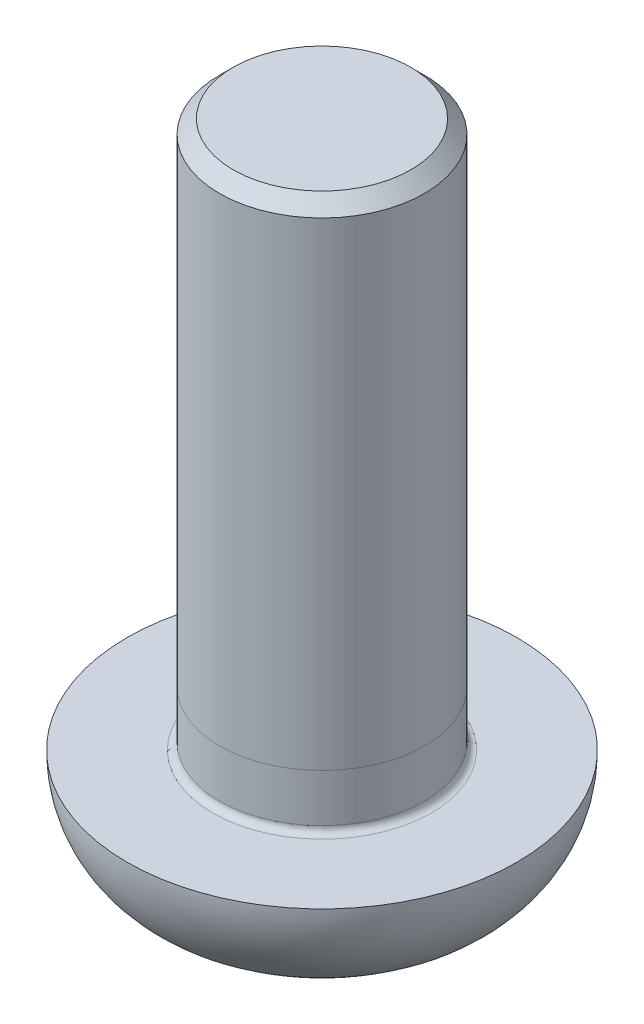
ISO-10303-21;
HEADER;
FILE_DESCRIPTION(('STEP AP214'),'2;1');
FILE_NAME('part.step','',(''),(''),'','','');
FILE_SCHEMA(('AUTOMOTIVE_DESIGN { 1 0 10303 214 1 1 1 1 }'));
ENDSEC;
DATA;
#1=APPLICATION_CONTEXT('core data for automotive mechanical design processes');
#2=APPLICATION_PROTOCOL_DEFINITION('international standard','automotive_design',2000,#1);
#3=PRODUCT_CONTEXT('',#1,'mechanical');
#4=PRODUCT('Part','Part','',(#3));
#5=PRODUCT_RELATED_PRODUCT_CATEGORY('part','',(#4));
#6=PRODUCT_DEFINITION_FORMATION('','',#4);
#7=PRODUCT_DEFINITION_CONTEXT('part definition',#1,'design');
#8=PRODUCT_DEFINITION('design','',#6,#7);
#9=PRODUCT_DEFINITION_SHAPE('','',#8);
#10=(LENGTH_UNIT() NAMED_UNIT(*) SI_UNIT(.MILLI.,.METRE.));
#11=(NAMED_UNIT(*) PLANE_ANGLE_UNIT() SI_UNIT($,.RADIAN.));
#12=(NAMED_UNIT(*) SI_UNIT($,.STERADIAN.) SOLID_ANGLE_UNIT());
#13=UNCERTAINTY_MEASURE_WITH_UNIT(LENGTH_MEASURE(1.E-05),#10,'distance_accuracy_value','');
#14=(GEOMETRIC_REPRESENTATION_CONTEXT(3) GLOBAL_UNCERTAINTY_ASSIGNED_CONTEXT((#13)) GLOBAL_UNIT_ASSIGNED_CONTEXT((#10,
#11,#12)) REPRESENTATION_CONTEXT('',''));
#15=CARTESIAN_POINT('',(0.,0.,0.));
#16=DIRECTION('',(0.,0.,1.));
#17=DIRECTION('',(1.,0.,0.));
#18=AXIS2_PLACEMENT_3D('',#15,#16,#17);
#19=CARTESIAN_POINT('',(0.,0.,0.));
#20=DIRECTION('',(0.,1.,0.));
#21=DIRECTION('',(0.,0.,1.));
#22=AXIS2_PLACEMENT_3D('',#19,#20,#21);
#23=CYLINDRICAL_SURFACE('',#22,1.5);
#24=CARTESIAN_POINT('',(0.,7.8,0.));
#25=DIRECTION('',(0.,1.,0.));
#26=DIRECTION('',(0.,0.,1.));
#27=AXIS2_PLACEMENT_3D('',#24,#25,#26);
#28=CIRCLE('',#27,1.5);
#29=CARTESIAN_POINT('',(0.,7.8,1.5));
#30=VERTEX_POINT('',#29);
#31=EDGE_CURVE('E28',#30,#30,#28,.F.);
#32=ORIENTED_EDGE('',*,*,#31,.T.);
#33=EDGE_LOOP('',(#32));
#34=FACE_BOUND('',#33,.T.);
#35=CARTESIAN_POINT('',(0.,0.8,0.));
#36=DIRECTION('',(0.,1.,0.));
#37=DIRECTION('',(0.,0.,1.));
#38=AXIS2_PLACEMENT_3D('',#35,#36,#37);
#39=CIRCLE('',#38,1.5);
#40=CARTESIAN_POINT('',(0.,0.8,1.5));
#41=VERTEX_POINT('',#40);
#42=EDGE_CURVE('E11',#41,#41,#39,.T.);
#43=ORIENTED_EDGE('',*,*,#42,.T.);
#44=EDGE_LOOP('',(#43));
#45=FACE_BOUND('',#44,.T.);
#46=ADVANCED_FACE('F18',(#34,#45),#23,.T.);
#47=ORIENTED_EDGE('',*,*,#42,.F.);
#48=EDGE_LOOP('',(#47));
#49=FACE_BOUND('',#48,.T.);
#50=CARTESIAN_POINT('',(0.,0.1,0.));
#51=DIRECTION('',(0.,1.,0.));
#52=DIRECTION('',(0.,0.,1.));
#53=AXIS2_PLACEMENT_3D('',#50,#51,#52);
#54=CIRCLE('',#53,1.5);
#55=CARTESIAN_POINT('',(0.,0.1,1.5));
#56=VERTEX_POINT('',#55);
#57=EDGE_CURVE('E280',#56,#56,#54,.T.);
#58=ORIENTED_EDGE('',*,*,#57,.T.);
#59=EDGE_LOOP('',(#58));
#60=FACE_BOUND('',#59,.T.);
#61=ADVANCED_FACE('F192',(#49,#60),#23,.T.);
#62=CARTESIAN_POINT('',(2.85,0.,0.));
#63=DIRECTION('',(0.,1.,0.));
#64=DIRECTION('',(0.,0.,1.));
#65=AXIS2_PLACEMENT_3D('',#62,#63,#64);
#66=PLANE('',#65);
#67=CARTESIAN_POINT('',(0.,0.,0.));
#68=DIRECTION('',(0.,1.,0.));
#69=DIRECTION('',(0.,0.,1.));
#70=AXIS2_PLACEMENT_3D('',#67,#68,#69);
#71=CIRCLE('',#70,1.6);
#72=CARTESIAN_POINT('',(0.,0.,1.6));
#73=VERTEX_POINT('',#72);
#74=EDGE_CURVE('E277',#73,#73,#71,.F.);
#75=ORIENTED_EDGE('',*,*,#74,.T.);
#76=EDGE_LOOP('',(#75));
#77=FACE_BOUND('',#76,.T.);
#78=CARTESIAN_POINT('',(0.,0.,0.));
#79=DIRECTION('',(0.,1.,0.));
#80=DIRECTION('',(0.,0.,1.));
#81=AXIS2_PLACEMENT_3D('',#78,#79,#80);
#82=CIRCLE('',#81,2.85);
#83=CARTESIAN_POINT('',(0.,0.,2.85));
#84=VERTEX_POINT('',#83);
#85=EDGE_CURVE('E108',#84,#84,#82,.T.);
#86=ORIENTED_EDGE('',*,*,#85,.T.);
#87=EDGE_LOOP('',(#86));
#88=FACE_BOUND('',#87,.T.);
#89=ADVANCED_FACE('F199',(#77,#88),#66,.T.);
#90=CARTESIAN_POINT('',(0.,8.,0.));
#91=DIRECTION('',(0.,1.,0.));
#92=DIRECTION('',(0.,0.,1.));
#93=AXIS2_PLACEMENT_3D('',#90,#91,#92);
#94=PLANE('',#93);
#95=CARTESIAN_POINT('',(0.,8.,0.));
#96=DIRECTION('',(0.,1.,0.));
#97=DIRECTION('',(0.,0.,1.));
#98=AXIS2_PLACEMENT_3D('',#95,#96,#97);
#99=CIRCLE('',#98,1.3);
#100=CARTESIAN_POINT('',(0.,8.,1.3));
#101=VERTEX_POINT('',#100);
#102=EDGE_CURVE('E282',#101,#101,#99,.T.);
#103=ORIENTED_EDGE('',*,*,#102,.T.);
#104=EDGE_LOOP('',(#103));
#105=FACE_BOUND('',#104,.T.);
#106=ADVANCED_FACE('F227',(#105),#94,.T.);
#107=CARTESIAN_POINT('',(0.,0.1,0.));
#108=DIRECTION('',(0.,1.,0.));
#109=DIRECTION('',(0.,0.,1.));
#110=AXIS2_PLACEMENT_3D('',#107,#108,#109);
#111=TOROIDAL_SURFACE('',#110,1.6,0.1);
#112=ORIENTED_EDGE('',*,*,#74,.F.);
#113=EDGE_LOOP('',(#112));
#114=FACE_BOUND('',#113,.T.);
#115=ORIENTED_EDGE('',*,*,#57,.F.);
#116=EDGE_LOOP('',(#115));
#117=FACE_BOUND('',#116,.T.);
#118=ADVANCED_FACE('F265',(#114,#117),#111,.F.);
#119=CARTESIAN_POINT('',(0.,8.,0.));
#120=DIRECTION('',(0.,-1.,0.));
#121=DIRECTION('',(0.,0.,-1.));
#122=AXIS2_PLACEMENT_3D('',#119,#120,#121);
#123=CONICAL_SURFACE('',#122,1.3,0.785398163397449);
#124=ORIENTED_EDGE('',*,*,#31,.F.);
#125=EDGE_LOOP('',(#124));
#126=FACE_BOUND('',#125,.T.);
#127=ORIENTED_EDGE('',*,*,#102,.F.);
#128=EDGE_LOOP('',(#127));
#129=FACE_BOUND('',#128,.T.);
#130=ADVANCED_FACE('F21',(#126,#129),#123,.T.);
#131=CARTESIAN_POINT('',(0.,0.,0.));
#132=DIRECTION('',(0.,-1.,0.));
#133=DIRECTION('',(0.,0.,-1.));
#134=AXIS2_PLACEMENT_3D('',#131,#132,#133);
#135=DEGENERATE_TOROIDAL_SURFACE('',#134,1.15723309668695,1.69276690331305,.T.);
#136=ORIENTED_EDGE('',*,*,#85,.F.);
#137=EDGE_LOOP('',(#136));
#138=FACE_BOUND('',#137,.T.);
#139=CARTESIAN_POINT('',(0.,-1.65,0.));
#140=DIRECTION('',(0.,-1.,0.));
#141=DIRECTION('',(0.,0.,-1.));
#142=AXIS2_PLACEMENT_3D('',#139,#140,#141);
#143=CIRCLE('',#142,1.53533333333333);
#144=CARTESIAN_POINT('',(0.,-1.65,-1.53533333333333));
#145=VERTEX_POINT('',#144);
#146=EDGE_CURVE('E119',#145,#145,#143,.T.);
#147=ORIENTED_EDGE('',*,*,#146,.F.);
#148=EDGE_LOOP('',(#147));
#149=FACE_BOUND('',#148,.T.);
#150=ADVANCED_FACE('F143',(#138,#149),#135,.T.);
#151=CARTESIAN_POINT('',(0.,0.343493969566669,0.));
#152=DIRECTION('',(0.,-1.,0.));
#153=DIRECTION('',(0.,0.,-1.));
#154=AXIS2_PLACEMENT_3D('',#151,#152,#153);
#155=CONICAL_SURFACE('',#154,0.,1.0471975511966);
#156=CARTESIAN_POINT('',(0.,0.343493969566668,0.));
#157=VERTEX_POINT('',#156);
#158=VERTEX_LOOP('',#157);
#159=FACE_BOUND('',#158,.T.);
#160=CARTESIAN_POINT('',(-0.57723479913579,-0.323239373765666,1.0002));
#161=CARTESIAN_POINT('',(-0.60260779582055,-0.308581670749146,0.95625268060172));
#162=CARTESIAN_POINT('',(-0.62819980753166,-0.295250420720894,0.911926016050179));
#163=CARTESIAN_POINT('',(-0.679827098330834,-0.271979204723454,0.822504925328877));
#164=CARTESIAN_POINT('',(-0.705863295614161,-0.262047473649781,0.777408908798268));
#165=CARTESIAN_POINT('',(-0.757612978088371,-0.246585391982078,0.68777582947738));
#166=CARTESIAN_POINT('',(-0.783318495222186,-0.240952165198952,0.643252567766779));
#167=CARTESIAN_POINT('',(-0.834850648373674,-0.234223985740253,0.55399626028498));
#168=CARTESIAN_POINT('',(-0.860677096749783,-0.233123465021663,0.509263539518502));
#169=CARTESIAN_POINT('',(-0.908946264126692,-0.235397749398137,0.42565888918265));
#170=CARTESIAN_POINT('',(-0.93139616328756,-0.238214135963409,0.386774523211231));
#171=CARTESIAN_POINT('',(-0.976149681982096,-0.247145147317349,0.309259155014812));
#172=CARTESIAN_POINT('',(-0.998453146411453,-0.253262830854298,0.27062842143836));
#173=CARTESIAN_POINT('',(-1.04329913914046,-0.268558422825822,0.192952883515854));
#174=CARTESIAN_POINT('',(-1.0658359836813,-0.277801249268959,0.153917923728832));
#175=CARTESIAN_POINT('',(-1.11057330008463,-0.298779542855529,0.0764306187239886));
#176=CARTESIAN_POINT('',(-1.13277434629517,-0.310510072233662,0.0379772787061415));
#177=CARTESIAN_POINT('',(-1.15481600843309,-0.323239373765665,-0.000199999999999969));
#178=B_SPLINE_CURVE_WITH_KNOTS('',3,(#160,#161,#162,#163,#164,#165,#166,#167,#168,#169,#170,
#171,#172,#173,#174,#175,#176,#177),.UNSPECIFIED.,.F.,.F.,(4,2,2,2,2,2,2,2,4),(0.,
0.158523820030117,0.317428970089344,0.472400167924636,0.627180939971652,0.762016584872713,
0.896977373984234,1.03493410168667,1.17261952416172),.UNSPECIFIED.);
#179=CARTESIAN_POINT('',(-0.577350269189628,-0.3231726971,1.));
#180=VERTEX_POINT('',#179);
#181=CARTESIAN_POINT('',(-1.15470053837925,-0.323172697099999,0.));
#182=VERTEX_POINT('',#181);
#183=EDGE_CURVE('E231',#180,#182,#178,.T.);
#184=ORIENTED_EDGE('',*,*,#183,.T.);
#185=CARTESIAN_POINT('',(-1.15481600843309,-0.323239373765666,0.000199999999999951));
#186=CARTESIAN_POINT('',(-1.12944301174833,-0.308581670749144,-0.0437473193982796));
#187=CARTESIAN_POINT('',(-1.10385100003722,-0.295250420720892,-0.0880739839498199));
#188=CARTESIAN_POINT('',(-1.05222370923805,-0.271979204723451,-0.177495074671121));
#189=CARTESIAN_POINT('',(-1.02618751195472,-0.262047473649778,-0.222591091201731));
#190=CARTESIAN_POINT('',(-0.974437829480509,-0.246585391982075,-0.312224170522618));
#191=CARTESIAN_POINT('',(-0.948732312346693,-0.240952165198949,-0.356747432233219));
#192=CARTESIAN_POINT('',(-0.897200159195205,-0.23422398574025,-0.446003739715017));
#193=CARTESIAN_POINT('',(-0.871373710819096,-0.233123465021662,-0.490736460481494));
#194=CARTESIAN_POINT('',(-0.823104543442187,-0.235397749398135,-0.574341110817346));
#195=CARTESIAN_POINT('',(-0.800654644281319,-0.238214135963406,-0.613225476788766));
#196=CARTESIAN_POINT('',(-0.755901125586783,-0.247145147317346,-0.690740844985186));
#197=CARTESIAN_POINT('',(-0.733597661157425,-0.253262830854295,-0.729371578561639));
#198=CARTESIAN_POINT('',(-0.688751668428417,-0.268558422825819,-0.807047116484145));
#199=CARTESIAN_POINT('',(-0.666214823887573,-0.277801249268956,-0.846082076271168));
#200=CARTESIAN_POINT('',(-0.621477507484248,-0.298779542855526,-0.923569381276012));
#201=CARTESIAN_POINT('',(-0.599276461273703,-0.31051007223366,-0.962022721293859));
#202=CARTESIAN_POINT('',(-0.577234799135786,-0.323239373765665,-1.0002));
#203=B_SPLINE_CURVE_WITH_KNOTS('',3,(#185,#186,#187,#188,#189,#190,#191,#192,#193,#194,#195,
#196,#197,#198,#199,#200,#201,#202),.UNSPECIFIED.,.F.,.F.,(4,2,2,2,2,2,2,2,4),(0.,
0.158523820030116,0.317428970089343,0.472400167924633,0.627180939971648,0.762016584872712,
0.896977373984234,1.03493410168667,1.17261952416172),.UNSPECIFIED.);
#204=CARTESIAN_POINT('',(-0.577350269189624,-0.323172697099998,-1.));
#205=VERTEX_POINT('',#204);
#206=EDGE_CURVE('E210',#182,#205,#203,.T.);
#207=ORIENTED_EDGE('',*,*,#206,.T.);
#208=CARTESIAN_POINT('',(-2.07504286794707,-0.986393607613955,-1.));
#209=CARTESIAN_POINT('',(-2.02682279106524,-0.961316377407704,-1.));
#210=CARTESIAN_POINT('',(-1.97853691004541,-0.936364946741178,-1.));
#211=CARTESIAN_POINT('',(-1.8818030933017,-0.886774929008181,-1.));
#212=CARTESIAN_POINT('',(-1.83335515294731,-0.862136350978961,-1.));
#213=CARTESIAN_POINT('',(-1.68757772249328,-0.788708866319357,-1.));
#214=CARTESIAN_POINT('',(-1.58996247918061,-0.740485578372843,-1.));
#215=CARTESIAN_POINT('',(-1.38815097133191,-0.643689275610979,-1.));
#216=CARTESIAN_POINT('',(-1.28389118372582,-0.595246614822795,-1.));
#217=CARTESIAN_POINT('',(-1.1261124150131,-0.525795403790139,-1.));
#218=CARTESIAN_POINT('',(-1.07330104577001,-0.503185593765542,-1.));
#219=CARTESIAN_POINT('',(-0.967092503842049,-0.459392656354955,-1.));
#220=CARTESIAN_POINT('',(-0.913695388590406,-0.438209390522896,-1.));
#221=CARTESIAN_POINT('',(-0.799511927621137,-0.395225105347771,-1.));
#222=CARTESIAN_POINT('',(-0.738630513241441,-0.373673326648714,-1.));
#223=CARTESIAN_POINT('',(-0.615756898059116,-0.333895444872872,-1.));
#224=CARTESIAN_POINT('',(-0.55376448427185,-0.315669987124044,-1.));
#225=CARTESIAN_POINT('',(-0.429844956310904,-0.284132130395532,-1.));
#226=CARTESIAN_POINT('',(-0.367941892041247,-0.270727798477079,-0.999999999999999));
#227=CARTESIAN_POINT('',(-0.243186894330265,-0.249688967026314,-1.));
#228=CARTESIAN_POINT('',(-0.180335941994431,-0.242048870164089,-1.));
#229=CARTESIAN_POINT('',(-0.0531170872123353,-0.23350346812294,-1.));
#230=CARTESIAN_POINT('',(0.0112587802010996,-0.232710778814144,-0.999999999999999));
#231=CARTESIAN_POINT('',(0.139698917999479,-0.238286345523692,-0.999999999999998));
#232=CARTESIAN_POINT('',(0.203763108167842,-0.244656356253859,-0.999999999999999));
#233=CARTESIAN_POINT('',(0.332282815414208,-0.263811380961666,-0.999999999999998));
#234=CARTESIAN_POINT('',(0.396717517990756,-0.276730366285534,-0.999999999999997));
#235=CARTESIAN_POINT('',(0.524373111070631,-0.307555063618328,-0.999999999999998));
#236=CARTESIAN_POINT('',(0.587593448223017,-0.32546299390357,-1.));
#237=CARTESIAN_POINT('',(0.714393281642093,-0.365369534566213,-1.));
#238=CARTESIAN_POINT('',(0.777944283333137,-0.387456844695104,-0.999999999999998));
#239=CARTESIAN_POINT('',(0.904055464216807,-0.434321064000253,-0.999999999999996));
#240=CARTESIAN_POINT('',(0.966615314988616,-0.459098844162117,-0.999999999999997));
#241=CARTESIAN_POINT('',(1.09101415590375,-0.510600578339333,-0.999999999999997));
#242=CARTESIAN_POINT('',(1.15285213540842,-0.537326951700803,-0.999999999999997));
#243=CARTESIAN_POINT('',(1.27590834026243,-0.592172327957835,-0.999999999999996));
#244=CARTESIAN_POINT('',(1.33712652584108,-0.620291419547209,-0.999999999999996));
#245=CARTESIAN_POINT('',(1.45527281806991,-0.675772911385423,-0.999999999999996));
#246=CARTESIAN_POINT('',(1.51223028309753,-0.703073061852557,-0.999999999999996));
#247=CARTESIAN_POINT('',(1.62580762087008,-0.75837113173608,-0.999999999999996));
#248=CARTESIAN_POINT('',(1.68242747958521,-0.786369079903627,-0.999999999999995));
#249=CARTESIAN_POINT('',(1.79517357157368,-0.842797054453244,-0.999999999999995));
#250=CARTESIAN_POINT('',(1.85130086971277,-0.871224958202004,-0.999999999999994));
#251=CARTESIAN_POINT('',(1.96332854560562,-0.928511693589308,-0.999999999999995));
#252=CARTESIAN_POINT('',(2.01922894445415,-0.957370483944579,-0.999999999999997));
#253=CARTESIAN_POINT('',(2.07504286794707,-0.986393607613955,-1.));
#254=B_SPLINE_CURVE_WITH_KNOTS('',3,(#208,#209,#210,#211,#212,#213,#214,#215,#216,#217,#218,
#219,#220,#221,#222,#223,#224,#225,#226,#227,#228,#229,#230,#231,#232,#233,#234,#235,#236,#237,
#238,#239,#240,#241,#242,#243,#244,#245,#246,#247,#248,#249,#250,#251,#252,#253),.UNSPECIFIED.,
.F.,.F.,(4,2,2,2,2,2,2,2,2,2,2,2,2,2,2,2,2,2,2,2,2,2,4),(0.,0.163053590937593,0.326111881273646,
0.652729035927794,0.997553167692492,1.16988107477401,1.34219223326344,1.53587473946493,
1.72959478148545,1.9193958400875,2.10901235532177,2.3017415782982,2.49451802619509,
2.69140757197867,2.88838480251726,3.09014067143474,3.29196205059307,3.49403842158144,
3.6961276781817,3.88560815647294,4.07509645482261,4.26384234904605,4.45257027410017),.UNSPECIFIED.);
#255=CARTESIAN_POINT('',(0.577350269189627,-0.323172697099998,-1.));
#256=VERTEX_POINT('',#255);
#257=EDGE_CURVE('E106',#205,#256,#254,.T.);
#258=ORIENTED_EDGE('',*,*,#257,.T.);
#259=CARTESIAN_POINT('',(0.577234799135789,-0.323239373765664,-1.0002));
#260=CARTESIAN_POINT('',(0.602607795820549,-0.308581670749144,-0.95625268060172));
#261=CARTESIAN_POINT('',(0.628199807531659,-0.295250420720892,-0.91192601605018));
#262=CARTESIAN_POINT('',(0.679827098330832,-0.271979204723452,-0.822504925328878));
#263=CARTESIAN_POINT('',(0.705863295614159,-0.262047473649779,-0.777408908798268));
#264=CARTESIAN_POINT('',(0.757612978088369,-0.246585391982076,-0.687775829477381));
#265=CARTESIAN_POINT('',(0.783318495222185,-0.24095216519895,-0.64325256776678));
#266=CARTESIAN_POINT('',(0.834850648373672,-0.234223985740251,-0.553996260284982));
#267=CARTESIAN_POINT('',(0.860677096749781,-0.233123465021662,-0.509263539518504));
#268=CARTESIAN_POINT('',(0.90894626412669,-0.235397749398136,-0.425658889182652));
#269=CARTESIAN_POINT('',(0.931396163287558,-0.238214135963407,-0.386774523211232));
#270=CARTESIAN_POINT('',(0.976149681982095,-0.247145147317348,-0.309259155014813));
#271=CARTESIAN_POINT('',(0.998453146411452,-0.253262830854298,-0.27062842143836));
#272=CARTESIAN_POINT('',(1.04329913914046,-0.268558422825821,-0.192952883515854));
#273=CARTESIAN_POINT('',(1.0658359836813,-0.277801249268959,-0.153917923728831));
#274=CARTESIAN_POINT('',(1.11057330008463,-0.298779542855529,-0.0764306187239865));
#275=CARTESIAN_POINT('',(1.13277434629517,-0.310510072233662,-0.0379772787061392));
#276=CARTESIAN_POINT('',(1.15481600843309,-0.323239373765666,0.000200000000001927));
#277=B_SPLINE_CURVE_WITH_KNOTS('',3,(#259,#260,#261,#262,#263,#264,#265,#266,#267,#268,#269,
#270,#271,#272,#273,#274,#275,#276),.UNSPECIFIED.,.F.,.F.,(4,2,2,2,2,2,2,2,4),(0.,
0.158523820030116,0.317428970089343,0.472400167924634,0.627180939971649,0.762016584872712,
0.896977373984234,1.03493410168667,1.17261952416172),.UNSPECIFIED.);
#278=CARTESIAN_POINT('',(1.15470053837925,-0.323172697099999,0.));
#279=VERTEX_POINT('',#278);
#280=EDGE_CURVE('E255',#256,#279,#277,.T.);
#281=ORIENTED_EDGE('',*,*,#280,.T.);
#282=CARTESIAN_POINT('',(1.15481600843309,-0.323239373765666,-0.000199999999998299));
#283=CARTESIAN_POINT('',(1.12944301174833,-0.308581670749145,0.043747319398281));
#284=CARTESIAN_POINT('',(1.10385100003722,-0.295250420720892,0.0880739839498211));
#285=CARTESIAN_POINT('',(1.05222370923805,-0.271979204723452,0.177495074671123));
#286=CARTESIAN_POINT('',(1.02618751195472,-0.262047473649779,0.222591091201732));
#287=CARTESIAN_POINT('',(0.974437829480509,-0.246585391982076,0.31222417052262));
#288=CARTESIAN_POINT('',(0.948732312346694,-0.240952165198951,0.35674743223322));
#289=CARTESIAN_POINT('',(0.897200159195205,-0.234223985740251,0.446003739715018));
#290=CARTESIAN_POINT('',(0.871373710819094,-0.233123465021662,0.490736460481495));
#291=CARTESIAN_POINT('',(0.823104543442185,-0.235397749398136,0.574341110817347));
#292=CARTESIAN_POINT('',(0.800654644281318,-0.238214135963407,0.613225476788768));
#293=CARTESIAN_POINT('',(0.755901125586783,-0.247145147317348,0.690740844985188));
#294=CARTESIAN_POINT('',(0.733597661157425,-0.253262830854297,0.729371578561641));
#295=CARTESIAN_POINT('',(0.688751668428417,-0.268558422825821,0.807047116484147));
#296=CARTESIAN_POINT('',(0.666214823887573,-0.277801249268958,0.846082076271169));
#297=CARTESIAN_POINT('',(0.621477507484247,-0.298779542855528,0.923569381276013));
#298=CARTESIAN_POINT('',(0.599276461273702,-0.310510072233661,0.96202272129386));
#299=CARTESIAN_POINT('',(0.577234799135783,-0.323239373765666,1.0002));
#300=B_SPLINE_CURVE_WITH_KNOTS('',3,(#282,#283,#284,#285,#286,#287,#288,#289,#290,#291,#292,
#293,#294,#295,#296,#297,#298,#299),.UNSPECIFIED.,.F.,.F.,(4,2,2,2,2,2,2,2,4),(0.,
0.158523820030116,0.317428970089343,0.472400167924634,0.627180939971649,0.762016584872712,
0.896977373984234,1.03493410168667,1.17261952416172),.UNSPECIFIED.);
#301=CARTESIAN_POINT('',(0.577350269189621,-0.323172697099999,1.));
#302=VERTEX_POINT('',#301);
#303=EDGE_CURVE('E249',#279,#302,#300,.T.);
#304=ORIENTED_EDGE('',*,*,#303,.T.);
#305=CARTESIAN_POINT('',(2.07504286794707,-0.986393607613953,1.));
#306=CARTESIAN_POINT('',(2.02682279106523,-0.961316377407702,1.));
#307=CARTESIAN_POINT('',(1.97853691004541,-0.936364946741176,1.));
#308=CARTESIAN_POINT('',(1.8818030933017,-0.886774929008179,1.));
#309=CARTESIAN_POINT('',(1.83335515294731,-0.862136350978959,1.));
#310=CARTESIAN_POINT('',(1.68757772249327,-0.788708866319355,1.));
#311=CARTESIAN_POINT('',(1.58996247918061,-0.740485578372841,1.));
#312=CARTESIAN_POINT('',(1.3881509713319,-0.643689275610978,1.));
#313=CARTESIAN_POINT('',(1.28389118372581,-0.595246614822793,1.));
#314=CARTESIAN_POINT('',(1.12611241501309,-0.525795403790138,1.));
#315=CARTESIAN_POINT('',(1.07330104577001,-0.503185593765541,1.));
#316=CARTESIAN_POINT('',(0.967092503842044,-0.459392656354954,1.));
#317=CARTESIAN_POINT('',(0.9136953885904,-0.438209390522895,1.));
#318=CARTESIAN_POINT('',(0.799511927621131,-0.39522510534777,1.));
#319=CARTESIAN_POINT('',(0.738630513241435,-0.373673326648713,1.));
#320=CARTESIAN_POINT('',(0.615756898059109,-0.333895444872871,1.));
#321=CARTESIAN_POINT('',(0.553764484271844,-0.315669987124044,1.));
#322=CARTESIAN_POINT('',(0.429844956310896,-0.284132130395532,1.));
#323=CARTESIAN_POINT('',(0.36794189204124,-0.270727798477079,0.999999999999999));
#324=CARTESIAN_POINT('',(0.243186894330257,-0.249688967026315,1.));
#325=CARTESIAN_POINT('',(0.180335941994423,-0.24204887016409,1.));
#326=CARTESIAN_POINT('',(0.0531170872123265,-0.233503468122942,1.));
#327=CARTESIAN_POINT('',(-0.0112587802011085,-0.232710778814146,0.999999999999999));
#328=CARTESIAN_POINT('',(-0.139698917999488,-0.238286345523695,0.999999999999998));
#329=CARTESIAN_POINT('',(-0.203763108167852,-0.244656356253862,0.999999999999999));
#330=CARTESIAN_POINT('',(-0.332282815414218,-0.26381138096167,0.999999999999998));
#331=CARTESIAN_POINT('',(-0.396717517990766,-0.276730366285537,0.999999999999997));
#332=CARTESIAN_POINT('',(-0.524373111070641,-0.307555063618332,0.999999999999998));
#333=CARTESIAN_POINT('',(-0.587593448223027,-0.325462993903575,1.));
#334=CARTESIAN_POINT('',(-0.714393281642102,-0.365369534566218,1.));
#335=CARTESIAN_POINT('',(-0.777944283333146,-0.387456844695108,0.999999999999998));
#336=CARTESIAN_POINT('',(-0.904055464216816,-0.434321064000257,0.999999999999996));
#337=CARTESIAN_POINT('',(-0.966615314988624,-0.459098844162121,0.999999999999997));
#338=CARTESIAN_POINT('',(-1.09101415590376,-0.510600578339336,0.999999999999997));
#339=CARTESIAN_POINT('',(-1.15285213540842,-0.537326951700806,0.999999999999997));
#340=CARTESIAN_POINT('',(-1.27590834026244,-0.592172327957838,0.999999999999996));
#341=CARTESIAN_POINT('',(-1.33712652584108,-0.620291419547212,0.999999999999996));
#342=CARTESIAN_POINT('',(-1.45527281806991,-0.675772911385425,0.999999999999996));
#343=CARTESIAN_POINT('',(-1.51223028309753,-0.703073061852559,0.999999999999996));
#344=CARTESIAN_POINT('',(-1.62580762087008,-0.758371131736082,0.999999999999996));
#345=CARTESIAN_POINT('',(-1.68242747958521,-0.786369079903628,0.999999999999995));
#346=CARTESIAN_POINT('',(-1.79517357157368,-0.842797054453244,0.999999999999995));
#347=CARTESIAN_POINT('',(-1.85130086971277,-0.871224958202004,0.999999999999994));
#348=CARTESIAN_POINT('',(-1.96332854560562,-0.928511693589307,0.999999999999995));
#349=CARTESIAN_POINT('',(-2.01922894445415,-0.957370483944578,0.999999999999997));
#350=CARTESIAN_POINT('',(-2.07504286794707,-0.986393607613954,1.));
#351=B_SPLINE_CURVE_WITH_KNOTS('',3,(#305,#306,#307,#308,#309,#310,#311,#312,#313,#314,#315,
#316,#317,#318,#319,#320,#321,#322,#323,#324,#325,#326,#327,#328,#329,#330,#331,#332,#333,#334,
#335,#336,#337,#338,#339,#340,#341,#342,#343,#344,#345,#346,#347,#348,#349,#350),.UNSPECIFIED.,
.F.,.F.,(4,2,2,2,2,2,2,2,2,2,2,2,2,2,2,2,2,2,2,2,2,2,4),(0.,0.163053590937593,0.326111881273647,
0.652729035927794,0.997553167692493,1.16988107477402,1.34219223326344,1.53587473946493,
1.72959478148545,1.9193958400875,2.10901235532177,2.3017415782982,2.4945180261951,
2.69140757197867,2.88838480251727,3.09014067143475,3.29196205059307,3.49403842158144,
3.6961276781817,3.88560815647294,4.0750964548226,4.26384234904604,4.45257027410017),.UNSPECIFIED.);
#352=EDGE_CURVE('E241',#302,#180,#351,.T.);
#353=ORIENTED_EDGE('',*,*,#352,.T.);
#354=EDGE_LOOP('',(#184,#207,#258,#281,#304,#353));
#355=FACE_BOUND('',#354,.T.);
#356=ADVANCED_FACE('F176',(#159,#355),#155,.F.);
#357=CARTESIAN_POINT('',(-0.577350269189624,10.9238816600125,-1.));
#358=DIRECTION('',(0.,0.,-1.));
#359=DIRECTION('',(-1.,0.,0.));
#360=AXIS2_PLACEMENT_3D('',#357,#358,#359);
#361=PLANE('',#360);
#362=CARTESIAN_POINT('',(1.77298423208036,-1.88602351298946,-1.));
#363=CARTESIAN_POINT('',(1.6875314224142,-1.86610755280139,-0.999999999999997));
#364=CARTESIAN_POINT('',(1.60200905768685,-1.84647117573885,-0.999999999999996));
#365=CARTESIAN_POINT('',(1.43073686786515,-1.80814400188846,-0.999999999999995));
#366=CARTESIAN_POINT('',(1.34498700367298,-1.78945338043572,-0.999999999999996));
#367=CARTESIAN_POINT('',(1.17236724871317,-1.7532364347891,-0.999999999999997));
#368=CARTESIAN_POINT('',(1.08549457829007,-1.73572320874417,-0.999999999999997));
#369=CARTESIAN_POINT('',(0.91134459775987,-1.70275076109791,-0.999999999999997));
#370=CARTESIAN_POINT('',(0.824067248828772,-1.68729174097644,-0.999999999999997));
#371=CARTESIAN_POINT('',(0.65141232127326,-1.65985747064075,-0.999999999999997));
#372=CARTESIAN_POINT('',(0.566048482649787,-1.64779812562985,-0.999999999999998));
#373=CARTESIAN_POINT('',(0.394830671520815,-1.62793838834702,-0.999999999999998));
#374=CARTESIAN_POINT('',(0.308976866107436,-1.62013662268202,-0.999999999999998));
#375=CARTESIAN_POINT('',(0.137316891887317,-1.6101398908392,-0.999999999999999));
#376=CARTESIAN_POINT('',(0.0515123087773134,-1.60791938694073,-0.999999999999999));
#377=CARTESIAN_POINT('',(-0.120045439178876,-1.6094913772906,-0.999999999999999));
#378=CARTESIAN_POINT('',(-0.205798600005085,-1.61328429248403,-1.));
#379=CARTESIAN_POINT('',(-0.353235352876963,-1.6243218351492,-1.));
#380=CARTESIAN_POINT('',(-0.415019607826427,-1.63032243172349,-1.));
#381=CARTESIAN_POINT('',(-0.538326391137577,-1.64454275255695,-1.));
#382=CARTESIAN_POINT('',(-0.599848925851934,-1.6527624226373,-1.));
#383=CARTESIAN_POINT('',(-0.784439968830874,-1.68002530242935,-1.));
#384=CARTESIAN_POINT('',(-0.907124209554365,-1.7016350390604,-1.));
#385=CARTESIAN_POINT('',(-1.09186138946571,-1.73715751580357,-1.));
#386=CARTESIAN_POINT('',(-1.15420316731235,-1.74966142848525,-1.));
#387=CARTESIAN_POINT('',(-1.2787312397021,-1.77543472468398,-1.));
#388=CARTESIAN_POINT('',(-1.3409175323186,-1.78870411763755,-1.));
#389=CARTESIAN_POINT('',(-1.46480859225419,-1.81573712068565,-1.));
#390=CARTESIAN_POINT('',(-1.5265140790948,-1.8294974692351,-1.));
#391=CARTESIAN_POINT('',(-1.64982040352173,-1.85745975284115,-1.));
#392=CARTESIAN_POINT('',(-1.71142124831725,-1.87166165605846,-1.));
#393=CARTESIAN_POINT('',(-1.77298423208036,-1.88602351298946,-1.));
#394=B_SPLINE_CURVE_WITH_KNOTS('',3,(#362,#363,#364,#365,#366,#367,#368,#369,#370,#371,#372,
#373,#374,#375,#376,#377,#378,#379,#380,#381,#382,#383,#384,#385,#386,#387,#388,#389,#390,#391,
#392,#393),.UNSPECIFIED.,.F.,.F.,(4,2,2,2,2,2,2,2,2,2,2,2,2,2,2,4),(0.,0.263234945820971,
0.52651851570911,0.792363841842592,1.0582352233017,1.31679695808678,1.5752752376771,
1.83256864859682,2.08988007109644,2.27606085771811,2.462237099135,2.83581575293878,
3.02656672097944,3.21732004101871,3.40698211336698,3.59663054127773),.UNSPECIFIED.);
#395=CARTESIAN_POINT('',(0.57735026918962,-1.65,-1.));
#396=VERTEX_POINT('',#395);
#397=CARTESIAN_POINT('',(-0.577350269189628,-1.65,-1.));
#398=VERTEX_POINT('',#397);
#399=EDGE_CURVE('E87',#396,#398,#394,.T.);
#400=ORIENTED_EDGE('',*,*,#399,.F.);
#401=DIRECTION('',(0.,-1.,0.));
#402=VECTOR('',#401,1.);
#403=CARTESIAN_POINT('',(0.577350269189627,10.9238816600125,-1.));
#404=LINE('',#403,#402);
#405=EDGE_CURVE('E109',#256,#396,#404,.T.);
#406=ORIENTED_EDGE('',*,*,#405,.F.);
#407=ORIENTED_EDGE('',*,*,#257,.F.);
#408=DIRECTION('',(0.,-1.,0.));
#409=VECTOR('',#408,1.);
#410=CARTESIAN_POINT('',(-0.577350269189624,10.9238816600125,-1.));
#411=LINE('',#410,#409);
#412=EDGE_CURVE('E99',#205,#398,#411,.T.);
#413=ORIENTED_EDGE('',*,*,#412,.T.);
#414=EDGE_LOOP('',(#400,#406,#407,#413));
#415=FACE_BOUND('',#414,.T.);
#416=ADVANCED_FACE('F104',(#415),#361,.F.);
#417=CARTESIAN_POINT('',(0.577350269189627,10.9238816600125,-1.));
#418=DIRECTION('',(0.866025403784439,0.,-0.5));
#419=DIRECTION('',(-0.5,0.,-0.866025403784439));
#420=AXIS2_PLACEMENT_3D('',#417,#418,#419);
#421=PLANE('',#420);
#422=CARTESIAN_POINT('',(1.15481600843309,-1.65003094474823,0.000200000000001785));
#423=CARTESIAN_POINT('',(1.13083054982755,-1.64359970627136,-0.0413440329476324));
#424=CARTESIAN_POINT('',(1.10680158691088,-1.63776108324611,-0.0829634175725025));
#425=CARTESIAN_POINT('',(1.05865875469988,-1.62750302526799,-0.166349248982214));
#426=CARTESIAN_POINT('',(1.03454485489538,-1.62308416744664,-0.20811574861223));
#427=CARTESIAN_POINT('',(0.986378434602868,-1.61592373892737,-0.29154243577758));
#428=CARTESIAN_POINT('',(0.962326240203119,-1.61317362448467,-0.333202058511468));
#429=CARTESIAN_POINT('',(0.914191160563778,-1.60948598841594,-0.416574462073182));
#430=CARTESIAN_POINT('',(0.890108282174109,-1.60854811567262,-0.458287231036591));
#431=CARTESIAN_POINT('',(0.841942525394771,-1.60854811567262,-0.541712768963408));
#432=CARTESIAN_POINT('',(0.817859647005103,-1.60948598841594,-0.583425537926817));
#433=CARTESIAN_POINT('',(0.769724567365761,-1.61317362448467,-0.666797941488531));
#434=CARTESIAN_POINT('',(0.745672372966013,-1.61592373892737,-0.708457564222419));
#435=CARTESIAN_POINT('',(0.697505952673499,-1.62308416744664,-0.791884251387769));
#436=CARTESIAN_POINT('',(0.673392052869001,-1.62750302526799,-0.833650751017785));
#437=CARTESIAN_POINT('',(0.625249220658003,-1.63776108324611,-0.917036582427496));
#438=CARTESIAN_POINT('',(0.601220257741328,-1.64359970627136,-0.958655967052366));
#439=CARTESIAN_POINT('',(0.577234799135789,-1.65003094474823,-1.0002));
#440=B_SPLINE_CURVE_WITH_KNOTS('',3,(#422,#423,#424,#425,#426,#427,#428,#429,#430,#431,#432,
#433,#434,#435,#436,#437,#438,#439),.UNSPECIFIED.,.F.,.F.,(4,2,2,2,2,2,2,2,4),(0.,
0.145207919576138,0.290474791401638,0.434991498754473,0.579480203548905,0.723968908343338,
0.868485615696173,1.01375248752167,1.15896040709781),.UNSPECIFIED.);
#441=CARTESIAN_POINT('',(1.15470053837926,-1.65,0.));
#442=VERTEX_POINT('',#441);
#443=EDGE_CURVE('E94',#442,#396,#440,.T.);
#444=ORIENTED_EDGE('',*,*,#443,.F.);
#445=DIRECTION('',(0.,-1.,0.));
#446=VECTOR('',#445,1.);
#447=CARTESIAN_POINT('',(1.15470053837925,10.9238816600125,0.));
#448=LINE('',#447,#446);
#449=EDGE_CURVE('E313',#279,#442,#448,.T.);
#450=ORIENTED_EDGE('',*,*,#449,.F.);
#451=ORIENTED_EDGE('',*,*,#280,.F.);
#452=ORIENTED_EDGE('',*,*,#405,.T.);
#453=EDGE_LOOP('',(#444,#450,#451,#452));
#454=FACE_BOUND('',#453,.T.);
#455=ADVANCED_FACE('F175',(#454),#421,.F.);
#456=CARTESIAN_POINT('',(1.15470053837925,10.9238816600125,0.));
#457=DIRECTION('',(0.866025403784437,0.,0.5));
#458=DIRECTION('',(0.5,0.,-0.866025403784437));
#459=AXIS2_PLACEMENT_3D('',#456,#457,#458);
#460=PLANE('',#459);
#461=CARTESIAN_POINT('',(0.577234799135783,-1.65003094474823,1.0002));
#462=CARTESIAN_POINT('',(0.601220257741324,-1.64359970627136,0.958655967052367));
#463=CARTESIAN_POINT('',(0.625249220658,-1.63776108324611,0.917036582427498));
#464=CARTESIAN_POINT('',(0.673392052868998,-1.62750302526799,0.833650751017787));
#465=CARTESIAN_POINT('',(0.697505952673496,-1.62308416744664,0.791884251387771));
#466=CARTESIAN_POINT('',(0.745672372966009,-1.61592373892737,0.70845756422242));
#467=CARTESIAN_POINT('',(0.769724567365758,-1.61317362448467,0.666797941488532));
#468=CARTESIAN_POINT('',(0.8178596470051,-1.60948598841594,0.583425537926819));
#469=CARTESIAN_POINT('',(0.841942525394768,-1.60854811567262,0.54171276896341));
#470=CARTESIAN_POINT('',(0.890108282174106,-1.60854811567262,0.458287231036592));
#471=CARTESIAN_POINT('',(0.914191160563775,-1.60948598841594,0.416574462073184));
#472=CARTESIAN_POINT('',(0.962326240203116,-1.61317362448467,0.33320205851147));
#473=CARTESIAN_POINT('',(0.986378434602865,-1.61592373892737,0.291542435777582));
#474=CARTESIAN_POINT('',(1.03454485489538,-1.62308416744664,0.208115748612232));
#475=CARTESIAN_POINT('',(1.05865875469988,-1.62750302526799,0.166349248982216));
#476=CARTESIAN_POINT('',(1.10680158691087,-1.63776108324611,0.0829634175725046));
#477=CARTESIAN_POINT('',(1.13083054982755,-1.64359970627136,0.0413440329476349));
#478=CARTESIAN_POINT('',(1.15481600843309,-1.65003094474823,-0.0001999999999983));
#479=B_SPLINE_CURVE_WITH_KNOTS('',3,(#461,#462,#463,#464,#465,#466,#467,#468,#469,#470,#471,
#472,#473,#474,#475,#476,#477,#478),.UNSPECIFIED.,.F.,.F.,(4,2,2,2,2,2,2,2,4),(0.,
0.145207919576138,0.290474791401638,0.434991498754473,0.579480203548905,0.723968908343338,
0.868485615696173,1.01375248752167,1.15896040709781),.UNSPECIFIED.);
#480=CARTESIAN_POINT('',(0.577350269189636,-1.65,1.));
#481=VERTEX_POINT('',#480);
#482=EDGE_CURVE('E128',#481,#442,#479,.T.);
#483=ORIENTED_EDGE('',*,*,#482,.F.);
#484=DIRECTION('',(0.,-1.,0.));
#485=VECTOR('',#484,1.);
#486=CARTESIAN_POINT('',(0.577350269189621,10.9238816600125,1.));
#487=LINE('',#486,#485);
#488=EDGE_CURVE('E310',#302,#481,#487,.T.);
#489=ORIENTED_EDGE('',*,*,#488,.F.);
#490=ORIENTED_EDGE('',*,*,#303,.F.);
#491=ORIENTED_EDGE('',*,*,#449,.T.);
#492=EDGE_LOOP('',(#483,#489,#490,#491));
#493=FACE_BOUND('',#492,.T.);
#494=ADVANCED_FACE('F179',(#493),#460,.F.);
#495=CARTESIAN_POINT('',(0.577350269189621,10.9238816600125,1.));
#496=DIRECTION('',(0.,0.,1.));
#497=DIRECTION('',(1.,0.,0.));
#498=AXIS2_PLACEMENT_3D('',#495,#496,#497);
#499=PLANE('',#498);
#500=CARTESIAN_POINT('',(-1.77298423208036,-1.88602351298946,1.));
#501=CARTESIAN_POINT('',(-1.6875314224142,-1.86610755280139,0.999999999999997));
#502=CARTESIAN_POINT('',(-1.60200905768685,-1.84647117573885,0.999999999999996));
#503=CARTESIAN_POINT('',(-1.43073686786515,-1.80814400188846,0.999999999999995));
#504=CARTESIAN_POINT('',(-1.34498700367298,-1.78945338043571,0.999999999999996));
#505=CARTESIAN_POINT('',(-1.17236724871316,-1.7532364347891,0.999999999999997));
#506=CARTESIAN_POINT('',(-1.08549457829007,-1.73572320874417,0.999999999999997));
#507=CARTESIAN_POINT('',(-0.911344597759866,-1.70275076109791,0.999999999999997));
#508=CARTESIAN_POINT('',(-0.824067248828768,-1.68729174097644,0.999999999999997));
#509=CARTESIAN_POINT('',(-0.651412321273256,-1.65985747064075,0.999999999999997));
#510=CARTESIAN_POINT('',(-0.566048482649783,-1.64779812562985,0.999999999999998));
#511=CARTESIAN_POINT('',(-0.39483067152081,-1.62793838834701,0.999999999999998));
#512=CARTESIAN_POINT('',(-0.308976866107431,-1.62013662268202,0.999999999999998));
#513=CARTESIAN_POINT('',(-0.137316891887311,-1.6101398908392,0.999999999999999));
#514=CARTESIAN_POINT('',(-0.0515123087773069,-1.60791938694073,0.999999999999999));
#515=CARTESIAN_POINT('',(0.120045439178883,-1.60949137729061,0.999999999999999));
#516=CARTESIAN_POINT('',(0.205798600005092,-1.61328429248404,1.));
#517=CARTESIAN_POINT('',(0.353235352876971,-1.6243218351492,1.));
#518=CARTESIAN_POINT('',(0.415019607826435,-1.63032243172349,1.));
#519=CARTESIAN_POINT('',(0.538326391137584,-1.64454275255695,1.));
#520=CARTESIAN_POINT('',(0.59984892585194,-1.6527624226373,1.));
#521=CARTESIAN_POINT('',(0.784439968830878,-1.68002530242936,1.));
#522=CARTESIAN_POINT('',(0.907124209554368,-1.7016350390604,1.));
#523=CARTESIAN_POINT('',(1.09186138946571,-1.73715751580357,1.));
#524=CARTESIAN_POINT('',(1.15420316731235,-1.74966142848525,1.));
#525=CARTESIAN_POINT('',(1.2787312397021,-1.77543472468399,1.));
#526=CARTESIAN_POINT('',(1.3409175323186,-1.78870411763755,1.));
#527=CARTESIAN_POINT('',(1.46480859225419,-1.81573712068566,1.));
#528=CARTESIAN_POINT('',(1.52651407909479,-1.8294974692351,1.));
#529=CARTESIAN_POINT('',(1.64982040352172,-1.85745975284115,1.));
#530=CARTESIAN_POINT('',(1.71142124831724,-1.87166165605846,1.));
#531=CARTESIAN_POINT('',(1.77298423208036,-1.88602351298946,1.));
#532=B_SPLINE_CURVE_WITH_KNOTS('',3,(#500,#501,#502,#503,#504,#505,#506,#507,#508,#509,#510,
#511,#512,#513,#514,#515,#516,#517,#518,#519,#520,#521,#522,#523,#524,#525,#526,#527,#528,#529,
#530,#531),.UNSPECIFIED.,.F.,.F.,(4,2,2,2,2,2,2,2,2,2,2,2,2,2,2,4),(0.,0.263234945820972,
0.526518515709112,0.792363841842594,1.05823522330171,1.31679695808678,1.57527523767711,
1.83256864859682,2.08988007109645,2.27606085771812,2.462237099135,2.83581575293878,
3.02656672097944,3.2173200410187,3.40698211336697,3.59663054127772),.UNSPECIFIED.);
#533=CARTESIAN_POINT('',(-0.577350269189628,-1.65,1.));
#534=VERTEX_POINT('',#533);
#535=EDGE_CURVE('E81',#534,#481,#532,.T.);
#536=ORIENTED_EDGE('',*,*,#535,.F.);
#537=DIRECTION('',(0.,-1.,0.));
#538=VECTOR('',#537,1.);
#539=CARTESIAN_POINT('',(-0.577350269189628,10.9238816600125,1.));
#540=LINE('',#539,#538);
#541=EDGE_CURVE('E42',#180,#534,#540,.T.);
#542=ORIENTED_EDGE('',*,*,#541,.F.);
#543=ORIENTED_EDGE('',*,*,#352,.F.);
#544=ORIENTED_EDGE('',*,*,#488,.T.);
#545=EDGE_LOOP('',(#536,#542,#543,#544));
#546=FACE_BOUND('',#545,.T.);
#547=ADVANCED_FACE('F135',(#546),#499,.F.);
#548=CARTESIAN_POINT('',(-0.577350269189628,10.9238816600125,1.));
#549=DIRECTION('',(-0.866025403784439,0.,0.5));
#550=DIRECTION('',(0.5,0.,0.86602540378444));
#551=AXIS2_PLACEMENT_3D('',#548,#549,#550);
#552=PLANE('',#551);
#553=CARTESIAN_POINT('',(-1.15481600843309,-1.65003094474823,-0.0002));
#554=CARTESIAN_POINT('',(-1.13083054982755,-1.64359970627136,0.0413440329476345));
#555=CARTESIAN_POINT('',(-1.10680158691088,-1.63776108324611,0.0829634175725047));
#556=CARTESIAN_POINT('',(-1.05865875469988,-1.62750302526799,0.166349248982216));
#557=CARTESIAN_POINT('',(-1.03454485489538,-1.62308416744664,0.208115748612232));
#558=CARTESIAN_POINT('',(-0.986378434602868,-1.61592373892737,0.291542435777582));
#559=CARTESIAN_POINT('',(-0.962326240203119,-1.61317362448467,0.33320205851147));
#560=CARTESIAN_POINT('',(-0.914191160563778,-1.60948598841594,0.416574462073183));
#561=CARTESIAN_POINT('',(-0.890108282174109,-1.60854811567262,0.458287231036592));
#562=CARTESIAN_POINT('',(-0.841942525394772,-1.60854811567262,0.541712768963409));
#563=CARTESIAN_POINT('',(-0.817859647005103,-1.60948598841594,0.583425537926818));
#564=CARTESIAN_POINT('',(-0.769724567365762,-1.61317362448467,0.666797941488532));
#565=CARTESIAN_POINT('',(-0.745672372966013,-1.61592373892737,0.70845756422242));
#566=CARTESIAN_POINT('',(-0.6975059526735,-1.62308416744664,0.79188425138777));
#567=CARTESIAN_POINT('',(-0.673392052869002,-1.62750302526799,0.833650751017785));
#568=CARTESIAN_POINT('',(-0.625249220658004,-1.63776108324611,0.917036582427497));
#569=CARTESIAN_POINT('',(-0.601220257741329,-1.64359970627136,0.958655967052366));
#570=CARTESIAN_POINT('',(-0.57723479913579,-1.65003094474823,1.0002));
#571=B_SPLINE_CURVE_WITH_KNOTS('',3,(#553,#554,#555,#556,#557,#558,#559,#560,#561,#562,#563,
#564,#565,#566,#567,#568,#569,#570),.UNSPECIFIED.,.F.,.F.,(4,2,2,2,2,2,2,2,4),(0.,
0.145207919576138,0.290474791401637,0.434991498754472,0.579480203548904,0.723968908343336,
0.868485615696171,1.01375248752167,1.15896040709781),.UNSPECIFIED.);
#572=CARTESIAN_POINT('',(-1.15470053837925,-1.65,0.));
#573=VERTEX_POINT('',#572);
#574=EDGE_CURVE('E149',#573,#534,#571,.T.);
#575=ORIENTED_EDGE('',*,*,#574,.F.);
#576=DIRECTION('',(0.,-1.,0.));
#577=VECTOR('',#576,1.);
#578=CARTESIAN_POINT('',(-1.15470053837925,10.9238816600125,0.));
#579=LINE('',#578,#577);
#580=EDGE_CURVE('E102',#182,#573,#579,.T.);
#581=ORIENTED_EDGE('',*,*,#580,.F.);
#582=ORIENTED_EDGE('',*,*,#183,.F.);
#583=ORIENTED_EDGE('',*,*,#541,.T.);
#584=EDGE_LOOP('',(#575,#581,#582,#583));
#585=FACE_BOUND('',#584,.T.);
#586=ADVANCED_FACE('F188',(#585),#552,.F.);
#587=CARTESIAN_POINT('',(-1.15470053837925,10.9238816600125,0.));
#588=DIRECTION('',(-0.866025403784438,0.,-0.5));
#589=DIRECTION('',(-0.5,0.,0.866025403784439));
#590=AXIS2_PLACEMENT_3D('',#587,#588,#589);
#591=PLANE('',#590);
#592=CARTESIAN_POINT('',(-0.577234799135786,-1.65003094474823,-1.0002));
#593=CARTESIAN_POINT('',(-0.601220257741325,-1.64359970627136,-0.958655967052366));
#594=CARTESIAN_POINT('',(-0.625249220658,-1.63776108324611,-0.917036582427496));
#595=CARTESIAN_POINT('',(-0.673392052868998,-1.62750302526799,-0.833650751017785));
#596=CARTESIAN_POINT('',(-0.697505952673496,-1.62308416744664,-0.791884251387769));
#597=CARTESIAN_POINT('',(-0.74567237296601,-1.61592373892736,-0.708457564222419));
#598=CARTESIAN_POINT('',(-0.769724567365758,-1.61317362448467,-0.666797941488531));
#599=CARTESIAN_POINT('',(-0.817859647005099,-1.60948598841594,-0.583425537926817));
#600=CARTESIAN_POINT('',(-0.841942525394768,-1.60854811567262,-0.541712768963409));
#601=CARTESIAN_POINT('',(-0.890108282174106,-1.60854811567262,-0.458287231036591));
#602=CARTESIAN_POINT('',(-0.914191160563774,-1.60948598841594,-0.416574462073183));
#603=CARTESIAN_POINT('',(-0.962326240203116,-1.61317362448467,-0.333202058511469));
#604=CARTESIAN_POINT('',(-0.986378434602864,-1.61592373892736,-0.291542435777581));
#605=CARTESIAN_POINT('',(-1.03454485489538,-1.62308416744664,-0.208115748612231));
#606=CARTESIAN_POINT('',(-1.05865875469988,-1.62750302526799,-0.166349248982215));
#607=CARTESIAN_POINT('',(-1.10680158691087,-1.63776108324611,-0.0829634175725038));
#608=CARTESIAN_POINT('',(-1.13083054982755,-1.64359970627136,-0.0413440329476339));
#609=CARTESIAN_POINT('',(-1.15481600843309,-1.65003094474823,0.000199999999999651));
#610=B_SPLINE_CURVE_WITH_KNOTS('',3,(#592,#593,#594,#595,#596,#597,#598,#599,#600,#601,#602,
#603,#604,#605,#606,#607,#608,#609),.UNSPECIFIED.,.F.,.F.,(4,2,2,2,2,2,2,2,4),(0.,
0.145207919576138,0.290474791401638,0.434991498754473,0.579480203548905,0.723968908343337,
0.868485615696172,1.01375248752167,1.15896040709781),.UNSPECIFIED.);
#611=EDGE_CURVE('E34',#398,#573,#610,.T.);
#612=ORIENTED_EDGE('',*,*,#611,.F.);
#613=ORIENTED_EDGE('',*,*,#412,.F.);
#614=ORIENTED_EDGE('',*,*,#206,.F.);
#615=ORIENTED_EDGE('',*,*,#580,.T.);
#616=EDGE_LOOP('',(#612,#613,#614,#615));
#617=FACE_BOUND('',#616,.T.);
#618=ADVANCED_FACE('F98',(#617),#591,.F.);
#619=CARTESIAN_POINT('',(0.,-1.3405989232415,0.));
#620=DIRECTION('',(0.,-1.,0.));
#621=DIRECTION('',(1.,0.,0.));
#622=AXIS2_PLACEMENT_3D('',#619,#620,#621);
#623=CONICAL_SURFACE('',#622,0.,1.30899693899574);
#624=ORIENTED_EDGE('',*,*,#399,.T.);
#625=CARTESIAN_POINT('',(0.,-1.65,0.));
#626=DIRECTION('',(0.,-1.,0.));
#627=DIRECTION('',(1.,0.,0.));
#628=AXIS2_PLACEMENT_3D('',#625,#626,#627);
#629=CIRCLE('',#628,1.15470053837925);
#630=EDGE_CURVE('E82',#398,#396,#629,.T.);
#631=ORIENTED_EDGE('',*,*,#630,.T.);
#632=EDGE_LOOP('',(#624,#631));
#633=FACE_BOUND('',#632,.T.);
#634=ADVANCED_FACE('F88',(#633),#623,.F.);
#635=ORIENTED_EDGE('',*,*,#443,.T.);
#636=EDGE_CURVE('E115',#396,#442,#629,.T.);
#637=ORIENTED_EDGE('',*,*,#636,.T.);
#638=EDGE_LOOP('',(#635,#637));
#639=FACE_BOUND('',#638,.T.);
#640=ADVANCED_FACE('F324',(#639),#623,.F.);
#641=ORIENTED_EDGE('',*,*,#482,.T.);
#642=EDGE_CURVE('E116',#442,#481,#629,.T.);
#643=ORIENTED_EDGE('',*,*,#642,.T.);
#644=EDGE_LOOP('',(#641,#643));
#645=FACE_BOUND('',#644,.T.);
#646=ADVANCED_FACE('F326',(#645),#623,.F.);
#647=ORIENTED_EDGE('',*,*,#535,.T.);
#648=EDGE_CURVE('E294',#481,#534,#629,.T.);
#649=ORIENTED_EDGE('',*,*,#648,.T.);
#650=EDGE_LOOP('',(#647,#649));
#651=FACE_BOUND('',#650,.T.);
#652=ADVANCED_FACE('F295',(#651),#623,.F.);
#653=ORIENTED_EDGE('',*,*,#574,.T.);
#654=EDGE_CURVE('E84',#534,#573,#629,.T.);
#655=ORIENTED_EDGE('',*,*,#654,.T.);
#656=EDGE_LOOP('',(#653,#655));
#657=FACE_BOUND('',#656,.T.);
#658=ADVANCED_FACE('F142',(#657),#623,.F.);
#659=ORIENTED_EDGE('',*,*,#611,.T.);
#660=EDGE_CURVE('E75',#573,#398,#629,.T.);
#661=ORIENTED_EDGE('',*,*,#660,.T.);
#662=EDGE_LOOP('',(#659,#661));
#663=FACE_BOUND('',#662,.T.);
#664=ADVANCED_FACE('F77',(#663),#623,.F.);
#665=CARTESIAN_POINT('',(0.,-1.65,0.));
#666=DIRECTION('',(0.,-1.,0.));
#667=DIRECTION('',(0.,0.,-1.));
#668=AXIS2_PLACEMENT_3D('',#665,#666,#667);
#669=PLANE('',#668);
#670=ORIENTED_EDGE('',*,*,#660,.F.);
#671=ORIENTED_EDGE('',*,*,#654,.F.);
#672=ORIENTED_EDGE('',*,*,#648,.F.);
#673=ORIENTED_EDGE('',*,*,#642,.F.);
#674=ORIENTED_EDGE('',*,*,#636,.F.);
#675=ORIENTED_EDGE('',*,*,#630,.F.);
#676=EDGE_LOOP('',(#670,#671,#672,#673,#674,#675));
#677=FACE_BOUND('',#676,.T.);
#678=ORIENTED_EDGE('',*,*,#146,.T.);
#679=EDGE_LOOP('',(#678));
#680=FACE_BOUND('',#679,.T.);
#681=ADVANCED_FACE('F112',(#677,#680),#669,.T.);
#682=CLOSED_SHELL('',(#46,#61,#89,#106,#118,#130,#150,#356,#416,#455,#494,#547,#586,#618,#634,
#640,#646,#652,#658,#664,#681));
#683=MANIFOLD_SOLID_BREP('B1',#682);
#684=ADVANCED_BREP_SHAPE_REPRESENTATION('',(#18,#683),#14);
#685=SHAPE_DEFINITION_REPRESENTATION(#9,#684);
ENDSEC;
END-ISO-10303-21;
